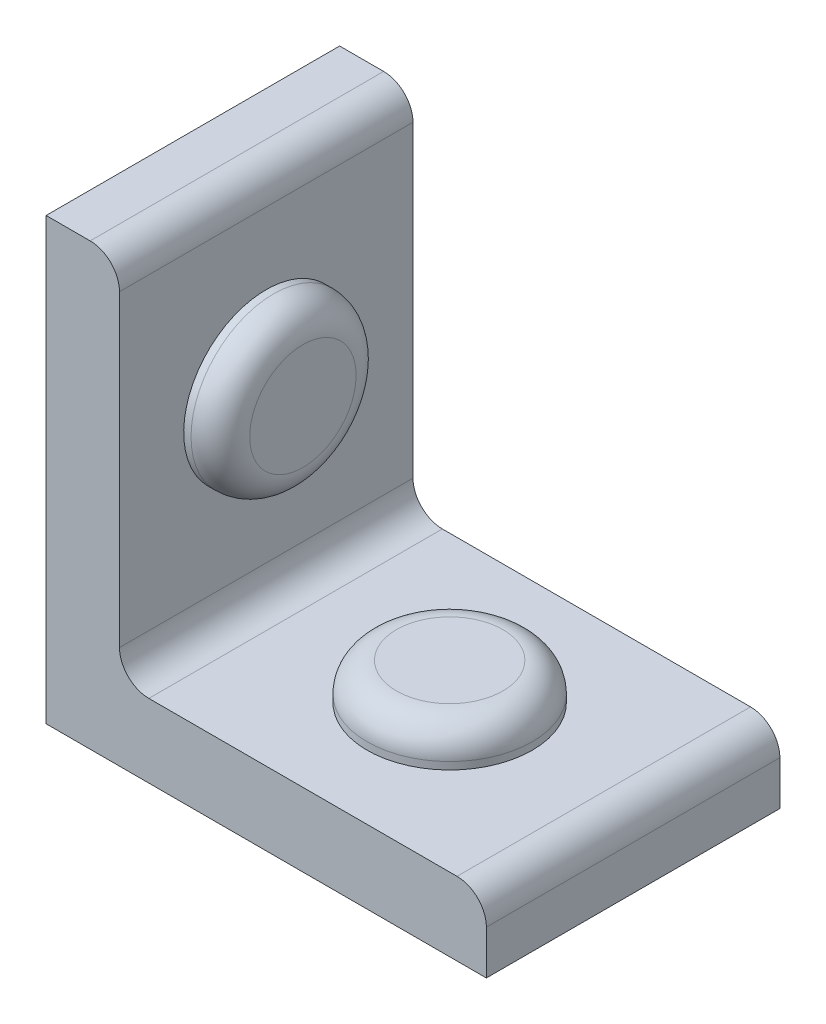
ISO-10303-21;
HEADER;
FILE_DESCRIPTION(('STEP AP214'),'2;1');
FILE_NAME('part.step','',(''),(''),'','','');
FILE_SCHEMA(('AUTOMOTIVE_DESIGN { 1 0 10303 214 1 1 1 1 }'));
ENDSEC;
DATA;
#1=APPLICATION_CONTEXT('core data for automotive mechanical design processes');
#2=APPLICATION_PROTOCOL_DEFINITION('international standard','automotive_design',2000,#1);
#3=PRODUCT_CONTEXT('',#1,'mechanical');
#4=PRODUCT('Part','Part','',(#3));
#5=PRODUCT_RELATED_PRODUCT_CATEGORY('part','',(#4));
#6=PRODUCT_DEFINITION_FORMATION('','',#4);
#7=PRODUCT_DEFINITION_CONTEXT('part definition',#1,'design');
#8=PRODUCT_DEFINITION('design','',#6,#7);
#9=PRODUCT_DEFINITION_SHAPE('','',#8);
#10=(LENGTH_UNIT() NAMED_UNIT(*) SI_UNIT(.MILLI.,.METRE.));
#11=(NAMED_UNIT(*) PLANE_ANGLE_UNIT() SI_UNIT($,.RADIAN.));
#12=(NAMED_UNIT(*) SI_UNIT($,.STERADIAN.) SOLID_ANGLE_UNIT());
#13=UNCERTAINTY_MEASURE_WITH_UNIT(LENGTH_MEASURE(1.E-05),#10,'distance_accuracy_value','');
#14=(GEOMETRIC_REPRESENTATION_CONTEXT(3) GLOBAL_UNCERTAINTY_ASSIGNED_CONTEXT((#13)) GLOBAL_UNIT_ASSIGNED_CONTEXT((#10,
#11,#12)) REPRESENTATION_CONTEXT('',''));
#15=CARTESIAN_POINT('',(0.,0.,0.));
#16=DIRECTION('',(0.,0.,1.));
#17=DIRECTION('',(1.,0.,0.));
#18=AXIS2_PLACEMENT_3D('',#15,#16,#17);
#19=CARTESIAN_POINT('',(0.,38.1,25.4));
#20=DIRECTION('',(1.,0.,0.));
#21=DIRECTION('',(0.,1.,0.));
#22=AXIS2_PLACEMENT_3D('',#19,#20,#21);
#23=PLANE('',#22);
#24=DIRECTION('',(0.,-1.,0.));
#25=VECTOR('',#24,1.);
#26=CARTESIAN_POINT('',(0.,38.1,0.));
#27=LINE('',#26,#25);
#28=CARTESIAN_POINT('',(0.,38.1,0.));
#29=VERTEX_POINT('',#28);
#30=CARTESIAN_POINT('',(0.,0.,0.));
#31=VERTEX_POINT('',#30);
#32=EDGE_CURVE('E150',#29,#31,#27,.T.);
#33=ORIENTED_EDGE('',*,*,#32,.T.);
#34=DIRECTION('',(0.,0.,-1.));
#35=VECTOR('',#34,1.);
#36=CARTESIAN_POINT('',(0.,0.,25.4));
#37=LINE('',#36,#35);
#38=CARTESIAN_POINT('',(0.,0.,25.4));
#39=VERTEX_POINT('',#38);
#40=EDGE_CURVE('E198',#39,#31,#37,.T.);
#41=ORIENTED_EDGE('',*,*,#40,.F.);
#42=DIRECTION('',(0.,-1.,0.));
#43=VECTOR('',#42,1.);
#44=CARTESIAN_POINT('',(0.,38.1,25.4));
#45=LINE('',#44,#43);
#46=CARTESIAN_POINT('',(0.,38.1,25.4));
#47=VERTEX_POINT('',#46);
#48=EDGE_CURVE('E175',#47,#39,#45,.T.);
#49=ORIENTED_EDGE('',*,*,#48,.F.);
#50=DIRECTION('',(0.,0.,-1.));
#51=VECTOR('',#50,1.);
#52=CARTESIAN_POINT('',(0.,38.1,25.4));
#53=LINE('',#52,#51);
#54=EDGE_CURVE('E146',#47,#29,#53,.T.);
#55=ORIENTED_EDGE('',*,*,#54,.T.);
#56=EDGE_LOOP('',(#33,#41,#49,#55));
#57=FACE_BOUND('',#56,.T.);
#58=ADVANCED_FACE('F41',(#57),#23,.F.);
#59=CARTESIAN_POINT('',(0.,0.,25.4));
#60=DIRECTION('',(0.,1.,0.));
#61=DIRECTION('',(0.,0.,1.));
#62=AXIS2_PLACEMENT_3D('',#59,#60,#61);
#63=PLANE('',#62);
#64=DIRECTION('',(1.,0.,0.));
#65=VECTOR('',#64,1.);
#66=CARTESIAN_POINT('',(0.,0.,0.));
#67=LINE('',#66,#65);
#68=CARTESIAN_POINT('',(38.1,0.,0.));
#69=VERTEX_POINT('',#68);
#70=EDGE_CURVE('E154',#31,#69,#67,.T.);
#71=ORIENTED_EDGE('',*,*,#70,.T.);
#72=DIRECTION('',(0.,0.,-1.));
#73=VECTOR('',#72,1.);
#74=CARTESIAN_POINT('',(38.1,0.,25.4));
#75=LINE('',#74,#73);
#76=CARTESIAN_POINT('',(38.1,0.,25.4));
#77=VERTEX_POINT('',#76);
#78=EDGE_CURVE('E194',#77,#69,#75,.T.);
#79=ORIENTED_EDGE('',*,*,#78,.F.);
#80=DIRECTION('',(1.,0.,0.));
#81=VECTOR('',#80,1.);
#82=CARTESIAN_POINT('',(0.,0.,25.4));
#83=LINE('',#82,#81);
#84=EDGE_CURVE('E106',#39,#77,#83,.T.);
#85=ORIENTED_EDGE('',*,*,#84,.F.);
#86=ORIENTED_EDGE('',*,*,#40,.T.);
#87=EDGE_LOOP('',(#71,#79,#85,#86));
#88=FACE_BOUND('',#87,.T.);
#89=ADVANCED_FACE('F231',(#88),#63,.F.);
#90=CARTESIAN_POINT('',(38.1,0.,25.4));
#91=DIRECTION('',(-1.,0.,0.));
#92=DIRECTION('',(0.,0.,1.));
#93=AXIS2_PLACEMENT_3D('',#90,#91,#92);
#94=PLANE('',#93);
#95=DIRECTION('',(0.,1.,0.));
#96=VECTOR('',#95,1.);
#97=CARTESIAN_POINT('',(38.1,0.,0.));
#98=LINE('',#97,#96);
#99=CARTESIAN_POINT('',(38.1,3.80999999999998,0.));
#100=VERTEX_POINT('',#99);
#101=EDGE_CURVE('E157',#69,#100,#98,.T.);
#102=ORIENTED_EDGE('',*,*,#101,.T.);
#103=DIRECTION('',(0.,0.,-1.));
#104=VECTOR('',#103,1.);
#105=CARTESIAN_POINT('',(38.1,3.80999999999998,25.4));
#106=LINE('',#105,#104);
#107=CARTESIAN_POINT('',(38.1,3.80999999999998,25.4));
#108=VERTEX_POINT('',#107);
#109=EDGE_CURVE('E190',#108,#100,#106,.T.);
#110=ORIENTED_EDGE('',*,*,#109,.F.);
#111=DIRECTION('',(0.,1.,0.));
#112=VECTOR('',#111,1.);
#113=CARTESIAN_POINT('',(38.1,0.,25.4));
#114=LINE('',#113,#112);
#115=EDGE_CURVE('E309',#77,#108,#114,.T.);
#116=ORIENTED_EDGE('',*,*,#115,.F.);
#117=ORIENTED_EDGE('',*,*,#78,.T.);
#118=EDGE_LOOP('',(#102,#110,#116,#117));
#119=FACE_BOUND('',#118,.T.);
#120=ADVANCED_FACE('F237',(#119),#94,.F.);
#121=CARTESIAN_POINT('',(35.56,3.81,25.4));
#122=DIRECTION('',(0.,0.,-1.));
#123=DIRECTION('',(-1.,0.,0.));
#124=AXIS2_PLACEMENT_3D('',#121,#122,#123);
#125=CYLINDRICAL_SURFACE('',#124,2.54);
#126=CARTESIAN_POINT('',(35.56,3.81,0.));
#127=DIRECTION('',(0.,0.,1.));
#128=DIRECTION('',(1.,0.,0.));
#129=AXIS2_PLACEMENT_3D('',#126,#127,#128);
#130=CIRCLE('',#129,2.54);
#131=CARTESIAN_POINT('',(35.56,6.35,0.));
#132=VERTEX_POINT('',#131);
#133=EDGE_CURVE('E160',#100,#132,#130,.T.);
#134=ORIENTED_EDGE('',*,*,#133,.T.);
#135=DIRECTION('',(0.,0.,-1.));
#136=VECTOR('',#135,1.);
#137=CARTESIAN_POINT('',(35.56,6.35,25.4));
#138=LINE('',#137,#136);
#139=CARTESIAN_POINT('',(35.56,6.35,25.4));
#140=VERTEX_POINT('',#139);
#141=EDGE_CURVE('E186',#140,#132,#138,.T.);
#142=ORIENTED_EDGE('',*,*,#141,.F.);
#143=CARTESIAN_POINT('',(35.56,3.81,25.4));
#144=DIRECTION('',(0.,0.,1.));
#145=DIRECTION('',(1.,0.,0.));
#146=AXIS2_PLACEMENT_3D('',#143,#144,#145);
#147=CIRCLE('',#146,2.54);
#148=EDGE_CURVE('E306',#108,#140,#147,.T.);
#149=ORIENTED_EDGE('',*,*,#148,.F.);
#150=ORIENTED_EDGE('',*,*,#109,.T.);
#151=EDGE_LOOP('',(#134,#142,#149,#150));
#152=FACE_BOUND('',#151,.T.);
#153=ADVANCED_FACE('F267',(#152),#125,.T.);
#154=CARTESIAN_POINT('',(35.56,6.35,25.4));
#155=DIRECTION('',(0.,-1.,0.));
#156=DIRECTION('',(1.,0.,0.));
#157=AXIS2_PLACEMENT_3D('',#154,#155,#156);
#158=PLANE('',#157);
#159=CARTESIAN_POINT('',(22.225,6.35,12.7));
#160=DIRECTION('',(0.,-1.,0.));
#161=DIRECTION('',(1.,0.,0.));
#162=AXIS2_PLACEMENT_3D('',#159,#160,#161);
#163=CIRCLE('',#162,7.14375);
#164=CARTESIAN_POINT('',(29.36875,6.35,12.7));
#165=VERTEX_POINT('',#164);
#166=EDGE_CURVE('E201',#165,#165,#163,.F.);
#167=ORIENTED_EDGE('',*,*,#166,.F.);
#168=EDGE_LOOP('',(#167));
#169=FACE_BOUND('',#168,.T.);
#170=DIRECTION('',(-1.,0.,0.));
#171=VECTOR('',#170,1.);
#172=CARTESIAN_POINT('',(35.56,6.35,0.));
#173=LINE('',#172,#171);
#174=CARTESIAN_POINT('',(8.89000000000002,6.35,0.));
#175=VERTEX_POINT('',#174);
#176=EDGE_CURVE('E163',#132,#175,#173,.T.);
#177=ORIENTED_EDGE('',*,*,#176,.T.);
#178=DIRECTION('',(0.,0.,-1.));
#179=VECTOR('',#178,1.);
#180=CARTESIAN_POINT('',(8.89000000000002,6.35,25.4));
#181=LINE('',#180,#179);
#182=CARTESIAN_POINT('',(8.89000000000002,6.35,25.4));
#183=VERTEX_POINT('',#182);
#184=EDGE_CURVE('E182',#183,#175,#181,.T.);
#185=ORIENTED_EDGE('',*,*,#184,.F.);
#186=DIRECTION('',(-1.,0.,0.));
#187=VECTOR('',#186,1.);
#188=CARTESIAN_POINT('',(35.56,6.35,25.4));
#189=LINE('',#188,#187);
#190=EDGE_CURVE('E308',#140,#183,#189,.T.);
#191=ORIENTED_EDGE('',*,*,#190,.F.);
#192=ORIENTED_EDGE('',*,*,#141,.T.);
#193=EDGE_LOOP('',(#177,#185,#191,#192));
#194=FACE_BOUND('',#193,.T.);
#195=ADVANCED_FACE('F263',(#169,#194),#158,.F.);
#196=CARTESIAN_POINT('',(8.89,8.89,25.4));
#197=DIRECTION('',(0.,0.,-1.));
#198=DIRECTION('',(-1.,0.,0.));
#199=AXIS2_PLACEMENT_3D('',#196,#197,#198);
#200=CYLINDRICAL_SURFACE('',#199,2.54);
#201=CARTESIAN_POINT('',(8.89,8.89,0.));
#202=DIRECTION('',(0.,0.,-1.));
#203=DIRECTION('',(-1.,0.,0.));
#204=AXIS2_PLACEMENT_3D('',#201,#202,#203);
#205=CIRCLE('',#204,2.54);
#206=CARTESIAN_POINT('',(6.35,8.89,0.));
#207=VERTEX_POINT('',#206);
#208=EDGE_CURVE('E166',#175,#207,#205,.T.);
#209=ORIENTED_EDGE('',*,*,#208,.T.);
#210=DIRECTION('',(0.,0.,-1.));
#211=VECTOR('',#210,1.);
#212=CARTESIAN_POINT('',(6.35,8.89,25.4));
#213=LINE('',#212,#211);
#214=CARTESIAN_POINT('',(6.35,8.89,25.4));
#215=VERTEX_POINT('',#214);
#216=EDGE_CURVE('E139',#215,#207,#213,.T.);
#217=ORIENTED_EDGE('',*,*,#216,.F.);
#218=CARTESIAN_POINT('',(8.89,8.89,25.4));
#219=DIRECTION('',(0.,0.,-1.));
#220=DIRECTION('',(-1.,0.,0.));
#221=AXIS2_PLACEMENT_3D('',#218,#219,#220);
#222=CIRCLE('',#221,2.54);
#223=EDGE_CURVE('E128',#183,#215,#222,.T.);
#224=ORIENTED_EDGE('',*,*,#223,.F.);
#225=ORIENTED_EDGE('',*,*,#184,.T.);
#226=EDGE_LOOP('',(#209,#217,#224,#225));
#227=FACE_BOUND('',#226,.T.);
#228=ADVANCED_FACE('F266',(#227),#200,.F.);
#229=CARTESIAN_POINT('',(6.35,8.89000000000002,25.4));
#230=DIRECTION('',(-1.,0.,0.));
#231=DIRECTION('',(0.,-1.,0.));
#232=AXIS2_PLACEMENT_3D('',#229,#230,#231);
#233=PLANE('',#232);
#234=CARTESIAN_POINT('',(6.35,22.225,12.7));
#235=DIRECTION('',(-1.,0.,0.));
#236=DIRECTION('',(0.,-1.,0.));
#237=AXIS2_PLACEMENT_3D('',#234,#235,#236);
#238=CIRCLE('',#237,7.14375);
#239=CARTESIAN_POINT('',(6.35,15.08125,12.7));
#240=VERTEX_POINT('',#239);
#241=EDGE_CURVE('E213',#240,#240,#238,.F.);
#242=ORIENTED_EDGE('',*,*,#241,.F.);
#243=EDGE_LOOP('',(#242));
#244=FACE_BOUND('',#243,.T.);
#245=DIRECTION('',(0.,1.,0.));
#246=VECTOR('',#245,1.);
#247=CARTESIAN_POINT('',(6.35,8.89000000000002,0.));
#248=LINE('',#247,#246);
#249=CARTESIAN_POINT('',(6.35,35.56,0.));
#250=VERTEX_POINT('',#249);
#251=EDGE_CURVE('E137',#207,#250,#248,.T.);
#252=ORIENTED_EDGE('',*,*,#251,.T.);
#253=DIRECTION('',(0.,0.,-1.));
#254=VECTOR('',#253,1.);
#255=CARTESIAN_POINT('',(6.35,35.56,25.4));
#256=LINE('',#255,#254);
#257=CARTESIAN_POINT('',(6.35,35.56,25.4));
#258=VERTEX_POINT('',#257);
#259=EDGE_CURVE('E134',#258,#250,#256,.T.);
#260=ORIENTED_EDGE('',*,*,#259,.F.);
#261=DIRECTION('',(0.,1.,0.));
#262=VECTOR('',#261,1.);
#263=CARTESIAN_POINT('',(6.35,8.89000000000002,25.4));
#264=LINE('',#263,#262);
#265=EDGE_CURVE('E122',#215,#258,#264,.T.);
#266=ORIENTED_EDGE('',*,*,#265,.F.);
#267=ORIENTED_EDGE('',*,*,#216,.T.);
#268=EDGE_LOOP('',(#252,#260,#266,#267));
#269=FACE_BOUND('',#268,.T.);
#270=ADVANCED_FACE('F135',(#244,#269),#233,.F.);
#271=CARTESIAN_POINT('',(3.81,35.56,25.4));
#272=DIRECTION('',(0.,0.,-1.));
#273=DIRECTION('',(-1.,0.,0.));
#274=AXIS2_PLACEMENT_3D('',#271,#272,#273);
#275=CYLINDRICAL_SURFACE('',#274,2.54);
#276=CARTESIAN_POINT('',(3.81,35.56,0.));
#277=DIRECTION('',(0.,0.,1.));
#278=DIRECTION('',(1.,0.,0.));
#279=AXIS2_PLACEMENT_3D('',#276,#277,#278);
#280=CIRCLE('',#279,2.54);
#281=CARTESIAN_POINT('',(3.80999999999998,38.1,0.));
#282=VERTEX_POINT('',#281);
#283=EDGE_CURVE('E91',#250,#282,#280,.T.);
#284=ORIENTED_EDGE('',*,*,#283,.T.);
#285=DIRECTION('',(0.,0.,-1.));
#286=VECTOR('',#285,1.);
#287=CARTESIAN_POINT('',(3.80999999999998,38.1,25.4));
#288=LINE('',#287,#286);
#289=CARTESIAN_POINT('',(3.80999999999998,38.1,25.4));
#290=VERTEX_POINT('',#289);
#291=EDGE_CURVE('E140',#290,#282,#288,.T.);
#292=ORIENTED_EDGE('',*,*,#291,.F.);
#293=CARTESIAN_POINT('',(3.81,35.56,25.4));
#294=DIRECTION('',(0.,0.,1.));
#295=DIRECTION('',(1.,0.,0.));
#296=AXIS2_PLACEMENT_3D('',#293,#294,#295);
#297=CIRCLE('',#296,2.54);
#298=EDGE_CURVE('E126',#258,#290,#297,.T.);
#299=ORIENTED_EDGE('',*,*,#298,.F.);
#300=ORIENTED_EDGE('',*,*,#259,.T.);
#301=EDGE_LOOP('',(#284,#292,#299,#300));
#302=FACE_BOUND('',#301,.T.);
#303=ADVANCED_FACE('F142',(#302),#275,.T.);
#304=CARTESIAN_POINT('',(3.80999999999998,38.1,25.4));
#305=DIRECTION('',(0.,-1.,0.));
#306=DIRECTION('',(0.,0.,-1.));
#307=AXIS2_PLACEMENT_3D('',#304,#305,#306);
#308=PLANE('',#307);
#309=DIRECTION('',(-1.,0.,0.));
#310=VECTOR('',#309,1.);
#311=CARTESIAN_POINT('',(3.80999999999998,38.1,0.));
#312=LINE('',#311,#310);
#313=EDGE_CURVE('E97',#282,#29,#312,.T.);
#314=ORIENTED_EDGE('',*,*,#313,.T.);
#315=ORIENTED_EDGE('',*,*,#54,.F.);
#316=DIRECTION('',(-1.,0.,0.));
#317=VECTOR('',#316,1.);
#318=CARTESIAN_POINT('',(3.80999999999998,38.1,25.4));
#319=LINE('',#318,#317);
#320=EDGE_CURVE('E59',#290,#47,#319,.T.);
#321=ORIENTED_EDGE('',*,*,#320,.F.);
#322=ORIENTED_EDGE('',*,*,#291,.T.);
#323=EDGE_LOOP('',(#314,#315,#321,#322));
#324=FACE_BOUND('',#323,.T.);
#325=ADVANCED_FACE('F281',(#324),#308,.F.);
#326=CARTESIAN_POINT('',(35.56,3.81,25.4));
#327=DIRECTION('',(0.,0.,1.));
#328=DIRECTION('',(1.,0.,0.));
#329=AXIS2_PLACEMENT_3D('',#326,#327,#328);
#330=PLANE('',#329);
#331=ORIENTED_EDGE('',*,*,#48,.T.);
#332=ORIENTED_EDGE('',*,*,#84,.T.);
#333=ORIENTED_EDGE('',*,*,#115,.T.);
#334=ORIENTED_EDGE('',*,*,#148,.T.);
#335=ORIENTED_EDGE('',*,*,#190,.T.);
#336=ORIENTED_EDGE('',*,*,#223,.T.);
#337=ORIENTED_EDGE('',*,*,#265,.T.);
#338=ORIENTED_EDGE('',*,*,#298,.T.);
#339=ORIENTED_EDGE('',*,*,#320,.T.);
#340=EDGE_LOOP('',(#331,#332,#333,#334,#335,#336,#337,#338,#339));
#341=FACE_BOUND('',#340,.T.);
#342=ADVANCED_FACE('F124',(#341),#330,.T.);
#343=CARTESIAN_POINT('',(35.56,3.81,0.));
#344=DIRECTION('',(0.,0.,1.));
#345=DIRECTION('',(1.,0.,0.));
#346=AXIS2_PLACEMENT_3D('',#343,#344,#345);
#347=PLANE('',#346);
#348=ORIENTED_EDGE('',*,*,#32,.F.);
#349=ORIENTED_EDGE('',*,*,#313,.F.);
#350=ORIENTED_EDGE('',*,*,#283,.F.);
#351=ORIENTED_EDGE('',*,*,#251,.F.);
#352=ORIENTED_EDGE('',*,*,#208,.F.);
#353=ORIENTED_EDGE('',*,*,#176,.F.);
#354=ORIENTED_EDGE('',*,*,#133,.F.);
#355=ORIENTED_EDGE('',*,*,#101,.F.);
#356=ORIENTED_EDGE('',*,*,#70,.F.);
#357=EDGE_LOOP('',(#348,#349,#350,#351,#352,#353,#354,#355,#356));
#358=FACE_BOUND('',#357,.T.);
#359=ADVANCED_FACE('F259',(#358),#347,.F.);
#360=CARTESIAN_POINT('',(22.225,9.525,12.7));
#361=DIRECTION('',(0.,-1.,0.));
#362=DIRECTION('',(1.,0.,0.));
#363=AXIS2_PLACEMENT_3D('',#360,#361,#362);
#364=CYLINDRICAL_SURFACE('',#363,7.14375);
#365=CARTESIAN_POINT('',(22.225,6.985,12.7));
#366=DIRECTION('',(0.,1.,0.));
#367=DIRECTION('',(-1.,0.,0.));
#368=AXIS2_PLACEMENT_3D('',#365,#366,#367);
#369=CIRCLE('',#368,7.14375);
#370=CARTESIAN_POINT('',(15.08125,6.985,12.7));
#371=VERTEX_POINT('',#370);
#372=EDGE_CURVE('E209',#371,#371,#369,.F.);
#373=ORIENTED_EDGE('',*,*,#372,.T.);
#374=EDGE_LOOP('',(#373));
#375=FACE_BOUND('',#374,.T.);
#376=ORIENTED_EDGE('',*,*,#166,.T.);
#377=EDGE_LOOP('',(#376));
#378=FACE_BOUND('',#377,.T.);
#379=ADVANCED_FACE('F250',(#375,#378),#364,.T.);
#380=CARTESIAN_POINT('',(22.225,9.525,12.7));
#381=DIRECTION('',(0.,1.,0.));
#382=DIRECTION('',(-1.,0.,0.));
#383=AXIS2_PLACEMENT_3D('',#380,#381,#382);
#384=PLANE('',#383);
#385=CARTESIAN_POINT('',(22.225,9.525,12.7));
#386=DIRECTION('',(0.,1.,0.));
#387=DIRECTION('',(-1.,0.,0.));
#388=AXIS2_PLACEMENT_3D('',#385,#386,#387);
#389=CIRCLE('',#388,4.60375);
#390=CARTESIAN_POINT('',(17.62125,9.525,12.7));
#391=VERTEX_POINT('',#390);
#392=EDGE_CURVE('E205',#391,#391,#389,.T.);
#393=ORIENTED_EDGE('',*,*,#392,.T.);
#394=EDGE_LOOP('',(#393));
#395=FACE_BOUND('',#394,.T.);
#396=ADVANCED_FACE('F242',(#395),#384,.T.);
#397=CARTESIAN_POINT('',(22.225,6.985,12.7));
#398=DIRECTION('',(0.,1.,0.));
#399=DIRECTION('',(-1.,0.,0.));
#400=AXIS2_PLACEMENT_3D('',#397,#398,#399);
#401=TOROIDAL_SURFACE('',#400,4.60375,2.54);
#402=ORIENTED_EDGE('',*,*,#372,.F.);
#403=EDGE_LOOP('',(#402));
#404=FACE_BOUND('',#403,.T.);
#405=ORIENTED_EDGE('',*,*,#392,.F.);
#406=EDGE_LOOP('',(#405));
#407=FACE_BOUND('',#406,.T.);
#408=ADVANCED_FACE('F240',(#404,#407),#401,.T.);
#409=CARTESIAN_POINT('',(9.525,22.225,12.7));
#410=DIRECTION('',(-1.,0.,0.));
#411=DIRECTION('',(0.,-1.,0.));
#412=AXIS2_PLACEMENT_3D('',#409,#410,#411);
#413=CYLINDRICAL_SURFACE('',#412,7.14375);
#414=CARTESIAN_POINT('',(6.985,22.225,12.7));
#415=DIRECTION('',(1.,0.,0.));
#416=DIRECTION('',(0.,1.,0.));
#417=AXIS2_PLACEMENT_3D('',#414,#415,#416);
#418=CIRCLE('',#417,7.14375);
#419=CARTESIAN_POINT('',(6.985,29.36875,12.7));
#420=VERTEX_POINT('',#419);
#421=EDGE_CURVE('E11',#420,#420,#418,.F.);
#422=ORIENTED_EDGE('',*,*,#421,.T.);
#423=EDGE_LOOP('',(#422));
#424=FACE_BOUND('',#423,.T.);
#425=ORIENTED_EDGE('',*,*,#241,.T.);
#426=EDGE_LOOP('',(#425));
#427=FACE_BOUND('',#426,.T.);
#428=ADVANCED_FACE('F227',(#424,#427),#413,.T.);
#429=CARTESIAN_POINT('',(9.525,22.225,12.7));
#430=DIRECTION('',(1.,0.,0.));
#431=DIRECTION('',(0.,1.,0.));
#432=AXIS2_PLACEMENT_3D('',#429,#430,#431);
#433=PLANE('',#432);
#434=CARTESIAN_POINT('',(9.525,22.225,12.7));
#435=DIRECTION('',(1.,0.,0.));
#436=DIRECTION('',(0.,1.,0.));
#437=AXIS2_PLACEMENT_3D('',#434,#435,#436);
#438=CIRCLE('',#437,4.60375);
#439=CARTESIAN_POINT('',(9.525,26.82875,12.7));
#440=VERTEX_POINT('',#439);
#441=EDGE_CURVE('E51',#440,#440,#438,.T.);
#442=ORIENTED_EDGE('',*,*,#441,.T.);
#443=EDGE_LOOP('',(#442));
#444=FACE_BOUND('',#443,.T.);
#445=ADVANCED_FACE('F220',(#444),#433,.T.);
#446=CARTESIAN_POINT('',(6.985,22.225,12.7));
#447=DIRECTION('',(1.,0.,0.));
#448=DIRECTION('',(0.,1.,0.));
#449=AXIS2_PLACEMENT_3D('',#446,#447,#448);
#450=TOROIDAL_SURFACE('',#449,4.60375,2.54);
#451=ORIENTED_EDGE('',*,*,#421,.F.);
#452=EDGE_LOOP('',(#451));
#453=FACE_BOUND('',#452,.T.);
#454=ORIENTED_EDGE('',*,*,#441,.F.);
#455=EDGE_LOOP('',(#454));
#456=FACE_BOUND('',#455,.T.);
#457=ADVANCED_FACE('F43',(#453,#456),#450,.T.);
#458=CLOSED_SHELL('',(#58,#89,#120,#153,#195,#228,#270,#303,#325,#342,#359,#379,#396,#408,#428,
#445,#457));
#459=MANIFOLD_SOLID_BREP('B2',#458);
#460=ADVANCED_BREP_SHAPE_REPRESENTATION('',(#18,#459),#14);
#461=SHAPE_DEFINITION_REPRESENTATION(#9,#460);
ENDSEC;
END-ISO-10303-21;
